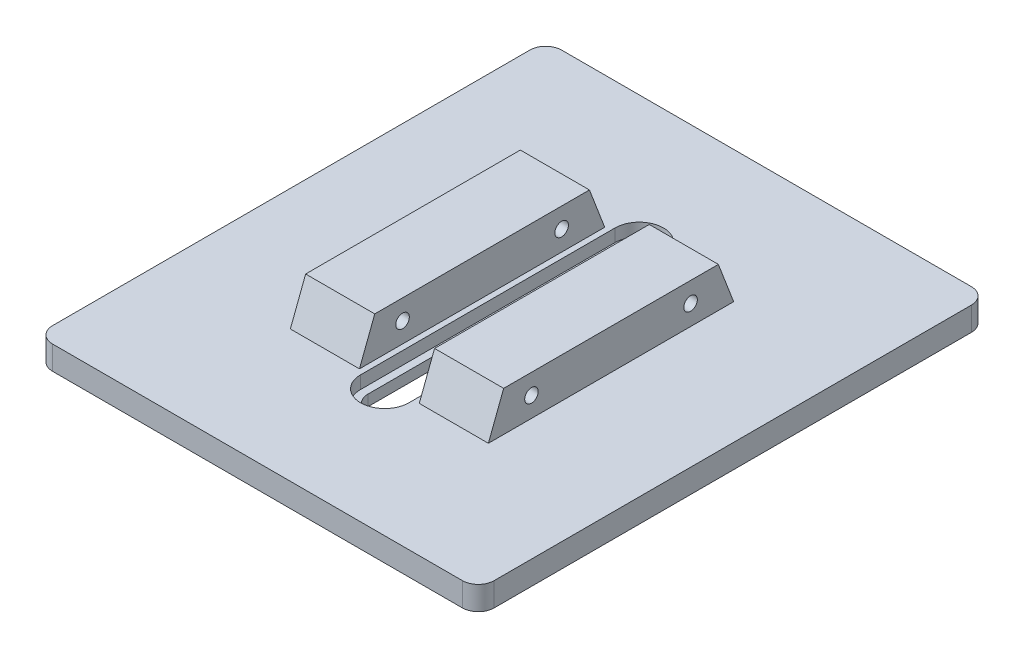
ISO-10303-21;
HEADER;
FILE_DESCRIPTION(('STEP AP214'),'2;1');
FILE_NAME('part.step','',(''),(''),'','','');
FILE_SCHEMA(('AUTOMOTIVE_DESIGN { 1 0 10303 214 1 1 1 1 }'));
ENDSEC;
DATA;
#1=APPLICATION_CONTEXT('core data for automotive mechanical design processes');
#2=APPLICATION_PROTOCOL_DEFINITION('international standard','automotive_design',2000,#1);
#3=PRODUCT_CONTEXT('',#1,'mechanical');
#4=PRODUCT('Part','Part','',(#3));
#5=PRODUCT_RELATED_PRODUCT_CATEGORY('part','',(#4));
#6=PRODUCT_DEFINITION_FORMATION('','',#4);
#7=PRODUCT_DEFINITION_CONTEXT('part definition',#1,'design');
#8=PRODUCT_DEFINITION('design','',#6,#7);
#9=PRODUCT_DEFINITION_SHAPE('','',#8);
#10=(LENGTH_UNIT() NAMED_UNIT(*) SI_UNIT(.MILLI.,.METRE.));
#11=(NAMED_UNIT(*) PLANE_ANGLE_UNIT() SI_UNIT($,.RADIAN.));
#12=(NAMED_UNIT(*) SI_UNIT($,.STERADIAN.) SOLID_ANGLE_UNIT());
#13=UNCERTAINTY_MEASURE_WITH_UNIT(LENGTH_MEASURE(1.E-05),#10,'distance_accuracy_value','');
#14=(GEOMETRIC_REPRESENTATION_CONTEXT(3) GLOBAL_UNCERTAINTY_ASSIGNED_CONTEXT((#13)) GLOBAL_UNIT_ASSIGNED_CONTEXT((#10,
#11,#12)) REPRESENTATION_CONTEXT('',''));
#15=CARTESIAN_POINT('',(0.,0.,0.));
#16=DIRECTION('',(0.,0.,1.));
#17=DIRECTION('',(1.,0.,0.));
#18=AXIS2_PLACEMENT_3D('',#15,#16,#17);
#19=CARTESIAN_POINT('',(-15.42415,0.,-5.20170833333334));
#20=DIRECTION('',(0.,1.,0.));
#21=DIRECTION('',(0.,0.,1.));
#22=AXIS2_PLACEMENT_3D('',#19,#20,#21);
#23=CYLINDRICAL_SURFACE('',#22,3.302);
#24=CARTESIAN_POINT('',(-15.42415,2.1844,-5.20170833333334));
#25=DIRECTION('',(0.,1.,0.));
#26=DIRECTION('',(0.,0.,1.));
#27=AXIS2_PLACEMENT_3D('',#24,#25,#26);
#28=CIRCLE('',#27,3.302);
#29=CARTESIAN_POINT('',(-12.12215,2.1844,-5.20170833333334));
#30=VERTEX_POINT('',#29);
#31=CARTESIAN_POINT('',(-18.72615,2.1844,-5.20170833333334));
#32=VERTEX_POINT('',#31);
#33=EDGE_CURVE('E410',#30,#32,#28,.F.);
#34=ORIENTED_EDGE('',*,*,#33,.F.);
#35=DIRECTION('',(0.,1.,0.));
#36=VECTOR('',#35,1.);
#37=CARTESIAN_POINT('',(-12.12215,0.,-5.20170833333334));
#38=LINE('',#37,#36);
#39=CARTESIAN_POINT('',(-12.12215,0.,-5.20170833333334));
#40=VERTEX_POINT('',#39);
#41=EDGE_CURVE('E321',#40,#30,#38,.T.);
#42=ORIENTED_EDGE('',*,*,#41,.F.);
#43=CARTESIAN_POINT('',(-15.42415,0.,-5.20170833333334));
#44=DIRECTION('',(0.,1.,0.));
#45=DIRECTION('',(0.,0.,1.));
#46=AXIS2_PLACEMENT_3D('',#43,#44,#45);
#47=CIRCLE('',#46,3.302);
#48=CARTESIAN_POINT('',(-18.72615,0.,-5.20170833333334));
#49=VERTEX_POINT('',#48);
#50=EDGE_CURVE('E412',#49,#40,#47,.T.);
#51=ORIENTED_EDGE('',*,*,#50,.F.);
#52=DIRECTION('',(0.,1.,0.));
#53=VECTOR('',#52,1.);
#54=CARTESIAN_POINT('',(-18.72615,0.,-5.20170833333334));
#55=LINE('',#54,#53);
#56=EDGE_CURVE('E332',#49,#32,#55,.T.);
#57=ORIENTED_EDGE('',*,*,#56,.T.);
#58=EDGE_LOOP('',(#34,#42,#51,#57));
#59=FACE_BOUND('',#58,.T.);
#60=ADVANCED_FACE('F35',(#59),#23,.F.);
#61=CARTESIAN_POINT('',(-18.72615,0.,-5.20170833333334));
#62=DIRECTION('',(-1.,0.,0.));
#63=DIRECTION('',(0.,0.,1.));
#64=AXIS2_PLACEMENT_3D('',#61,#62,#63);
#65=PLANE('',#64);
#66=DIRECTION('',(0.,0.,-1.));
#67=VECTOR('',#66,1.);
#68=CARTESIAN_POINT('',(-18.72615,2.1844,-5.20170833333334));
#69=LINE('',#68,#67);
#70=CARTESIAN_POINT('',(-18.72615,2.1844,-56.0017083333333));
#71=VERTEX_POINT('',#70);
#72=EDGE_CURVE('E408',#32,#71,#69,.T.);
#73=ORIENTED_EDGE('',*,*,#72,.F.);
#74=ORIENTED_EDGE('',*,*,#56,.F.);
#75=DIRECTION('',(0.,0.,1.));
#76=VECTOR('',#75,1.);
#77=CARTESIAN_POINT('',(-18.72615,0.,-5.20170833333334));
#78=LINE('',#77,#76);
#79=CARTESIAN_POINT('',(-18.72615,0.,-56.0017083333333));
#80=VERTEX_POINT('',#79);
#81=EDGE_CURVE('E421',#80,#49,#78,.T.);
#82=ORIENTED_EDGE('',*,*,#81,.F.);
#83=DIRECTION('',(0.,1.,0.));
#84=VECTOR('',#83,1.);
#85=CARTESIAN_POINT('',(-18.72615,0.,-56.0017083333333));
#86=LINE('',#85,#84);
#87=EDGE_CURVE('E426',#80,#71,#86,.T.);
#88=ORIENTED_EDGE('',*,*,#87,.T.);
#89=EDGE_LOOP('',(#73,#74,#82,#88));
#90=FACE_BOUND('',#89,.T.);
#91=ADVANCED_FACE('F445',(#90),#65,.F.);
#92=CARTESIAN_POINT('',(-15.42415,0.,-56.0017083333333));
#93=DIRECTION('',(0.,1.,0.));
#94=DIRECTION('',(0.,0.,1.));
#95=AXIS2_PLACEMENT_3D('',#92,#93,#94);
#96=CYLINDRICAL_SURFACE('',#95,3.302);
#97=CARTESIAN_POINT('',(-15.42415,2.1844,-56.0017083333333));
#98=DIRECTION('',(0.,1.,0.));
#99=DIRECTION('',(0.,0.,1.));
#100=AXIS2_PLACEMENT_3D('',#97,#98,#99);
#101=CIRCLE('',#100,3.302);
#102=CARTESIAN_POINT('',(-12.12215,2.1844,-56.0017083333333));
#103=VERTEX_POINT('',#102);
#104=EDGE_CURVE('E399',#71,#103,#101,.F.);
#105=ORIENTED_EDGE('',*,*,#104,.F.);
#106=ORIENTED_EDGE('',*,*,#87,.F.);
#107=CARTESIAN_POINT('',(-15.42415,0.,-56.0017083333333));
#108=DIRECTION('',(0.,1.,0.));
#109=DIRECTION('',(0.,0.,1.));
#110=AXIS2_PLACEMENT_3D('',#107,#108,#109);
#111=CIRCLE('',#110,3.302);
#112=CARTESIAN_POINT('',(-12.12215,0.,-56.0017083333333));
#113=VERTEX_POINT('',#112);
#114=EDGE_CURVE('E418',#113,#80,#111,.T.);
#115=ORIENTED_EDGE('',*,*,#114,.F.);
#116=DIRECTION('',(0.,1.,0.));
#117=VECTOR('',#116,1.);
#118=CARTESIAN_POINT('',(-12.12215,0.,-56.0017083333333));
#119=LINE('',#118,#117);
#120=EDGE_CURVE('E428',#113,#103,#119,.T.);
#121=ORIENTED_EDGE('',*,*,#120,.T.);
#122=EDGE_LOOP('',(#105,#106,#115,#121));
#123=FACE_BOUND('',#122,.T.);
#124=ADVANCED_FACE('F447',(#123),#96,.F.);
#125=CARTESIAN_POINT('',(-12.12215,0.,-5.20170833333334));
#126=DIRECTION('',(1.,0.,0.));
#127=DIRECTION('',(0.,0.,-1.));
#128=AXIS2_PLACEMENT_3D('',#125,#126,#127);
#129=PLANE('',#128);
#130=DIRECTION('',(0.,0.,1.));
#131=VECTOR('',#130,1.);
#132=CARTESIAN_POINT('',(-12.12215,2.1844,-5.20170833333334));
#133=LINE('',#132,#131);
#134=EDGE_CURVE('E239',#103,#30,#133,.T.);
#135=ORIENTED_EDGE('',*,*,#134,.F.);
#136=ORIENTED_EDGE('',*,*,#120,.F.);
#137=DIRECTION('',(0.,0.,-1.));
#138=VECTOR('',#137,1.);
#139=CARTESIAN_POINT('',(-12.12215,0.,-5.20170833333334));
#140=LINE('',#139,#138);
#141=EDGE_CURVE('E415',#40,#113,#140,.T.);
#142=ORIENTED_EDGE('',*,*,#141,.F.);
#143=ORIENTED_EDGE('',*,*,#41,.T.);
#144=EDGE_LOOP('',(#135,#136,#142,#143));
#145=FACE_BOUND('',#144,.T.);
#146=ADVANCED_FACE('F437',(#145),#129,.F.);
#147=CARTESIAN_POINT('',(0.,12.7,0.));
#148=DIRECTION('',(0.,1.,0.));
#149=DIRECTION('',(0.,0.,1.));
#150=AXIS2_PLACEMENT_3D('',#147,#148,#149);
#151=PLANE('',#150);
#152=DIRECTION('',(1.,0.,0.));
#153=VECTOR('',#152,1.);
#154=CARTESIAN_POINT('',(0.,12.7,-52.0257445406089));
#155=LINE('',#154,#153);
#156=CARTESIAN_POINT('',(-9.45514999999998,12.7,-52.0257445406089));
#157=VERTEX_POINT('',#156);
#158=CARTESIAN_POINT('',(4.33705000000002,12.7,-52.0257445406089));
#159=VERTEX_POINT('',#158);
#160=EDGE_CURVE('E58',#157,#159,#155,.T.);
#161=ORIENTED_EDGE('',*,*,#160,.F.);
#162=DIRECTION('',(0.,0.,-1.));
#163=VECTOR('',#162,1.);
#164=CARTESIAN_POINT('',(-9.45514999999998,12.7,20.1982916666667));
#165=LINE('',#164,#163);
#166=CARTESIAN_POINT('',(-9.45514999999998,12.7,-9.17767212605782));
#167=VERTEX_POINT('',#166);
#168=EDGE_CURVE('E330',#167,#157,#165,.T.);
#169=ORIENTED_EDGE('',*,*,#168,.F.);
#170=DIRECTION('',(-1.,0.,0.));
#171=VECTOR('',#170,1.);
#172=CARTESIAN_POINT('',(0.,12.7,-9.17767212605782));
#173=LINE('',#172,#171);
#174=CARTESIAN_POINT('',(4.33705000000003,12.7,-9.17767212605783));
#175=VERTEX_POINT('',#174);
#176=EDGE_CURVE('E514',#175,#167,#173,.T.);
#177=ORIENTED_EDGE('',*,*,#176,.F.);
#178=DIRECTION('',(0.,0.,1.));
#179=VECTOR('',#178,1.);
#180=CARTESIAN_POINT('',(4.33705000000002,12.7,-81.4017083333333));
#181=LINE('',#180,#179);
#182=EDGE_CURVE('E315',#159,#175,#181,.T.);
#183=ORIENTED_EDGE('',*,*,#182,.F.);
#184=EDGE_LOOP('',(#161,#169,#177,#183));
#185=FACE_BOUND('',#184,.T.);
#186=ADVANCED_FACE('F460',(#185),#151,.T.);
#187=CARTESIAN_POINT('',(-59.49315,12.7,-81.4017083333333));
#188=DIRECTION('',(1.,0.,0.));
#189=DIRECTION('',(0.,0.,-1.));
#190=AXIS2_PLACEMENT_3D('',#187,#188,#189);
#191=PLANE('',#190);
#192=DIRECTION('',(0.,0.,1.));
#193=VECTOR('',#192,1.);
#194=CARTESIAN_POINT('',(-59.49315,0.,-81.4017083333333));
#195=LINE('',#194,#193);
#196=CARTESIAN_POINT('',(-59.49315,0.,-78.2267083333333));
#197=VERTEX_POINT('',#196);
#198=CARTESIAN_POINT('',(-59.49315,0.,17.0232916666667));
#199=VERTEX_POINT('',#198);
#200=EDGE_CURVE('E220',#197,#199,#195,.T.);
#201=ORIENTED_EDGE('',*,*,#200,.T.);
#202=DIRECTION('',(0.,-1.,0.));
#203=VECTOR('',#202,1.);
#204=CARTESIAN_POINT('',(-59.49315,12.7,17.0232916666667));
#205=LINE('',#204,#203);
#206=CARTESIAN_POINT('',(-59.49315,4.7244,17.0232916666667));
#207=VERTEX_POINT('',#206);
#208=EDGE_CURVE('E257',#199,#207,#205,.F.);
#209=ORIENTED_EDGE('',*,*,#208,.T.);
#210=DIRECTION('',(0.,0.,1.));
#211=VECTOR('',#210,1.);
#212=CARTESIAN_POINT('',(-59.49315,4.7244,-81.4017083333333));
#213=LINE('',#212,#211);
#214=CARTESIAN_POINT('',(-59.49315,4.7244,-78.2267083333333));
#215=VERTEX_POINT('',#214);
#216=EDGE_CURVE('E217',#215,#207,#213,.T.);
#217=ORIENTED_EDGE('',*,*,#216,.F.);
#218=DIRECTION('',(0.,-1.,0.));
#219=VECTOR('',#218,1.);
#220=CARTESIAN_POINT('',(-59.49315,12.7,-78.2267083333333));
#221=LINE('',#220,#219);
#222=EDGE_CURVE('E254',#215,#197,#221,.T.);
#223=ORIENTED_EDGE('',*,*,#222,.T.);
#224=EDGE_LOOP('',(#201,#209,#217,#223));
#225=FACE_BOUND('',#224,.T.);
#226=ADVANCED_FACE('F294',(#225),#191,.F.);
#227=CARTESIAN_POINT('',(-59.49315,12.7,20.1982916666667));
#228=DIRECTION('',(0.,0.,-1.));
#229=DIRECTION('',(-1.,0.,0.));
#230=AXIS2_PLACEMENT_3D('',#227,#228,#229);
#231=PLANE('',#230);
#232=DIRECTION('',(1.,0.,0.));
#233=VECTOR('',#232,1.);
#234=CARTESIAN_POINT('',(28.64485,4.7244,20.1982916666667));
#235=LINE('',#234,#233);
#236=CARTESIAN_POINT('',(-56.31815,4.7244,20.1982916666667));
#237=VERTEX_POINT('',#236);
#238=CARTESIAN_POINT('',(25.46985,4.7244,20.1982916666667));
#239=VERTEX_POINT('',#238);
#240=EDGE_CURVE('E227',#237,#239,#235,.T.);
#241=ORIENTED_EDGE('',*,*,#240,.F.);
#242=DIRECTION('',(0.,-1.,0.));
#243=VECTOR('',#242,1.);
#244=CARTESIAN_POINT('',(-56.31815,12.7,20.1982916666667));
#245=LINE('',#244,#243);
#246=CARTESIAN_POINT('',(-56.31815,0.,20.1982916666667));
#247=VERTEX_POINT('',#246);
#248=EDGE_CURVE('E243',#237,#247,#245,.T.);
#249=ORIENTED_EDGE('',*,*,#248,.T.);
#250=DIRECTION('',(1.,0.,0.));
#251=VECTOR('',#250,1.);
#252=CARTESIAN_POINT('',(-59.49315,0.,20.1982916666667));
#253=LINE('',#252,#251);
#254=CARTESIAN_POINT('',(25.46985,0.,20.1982916666667));
#255=VERTEX_POINT('',#254);
#256=EDGE_CURVE('E230',#247,#255,#253,.T.);
#257=ORIENTED_EDGE('',*,*,#256,.T.);
#258=DIRECTION('',(0.,-1.,0.));
#259=VECTOR('',#258,1.);
#260=CARTESIAN_POINT('',(25.46985,12.7,20.1982916666667));
#261=LINE('',#260,#259);
#262=EDGE_CURVE('E241',#255,#239,#261,.F.);
#263=ORIENTED_EDGE('',*,*,#262,.T.);
#264=EDGE_LOOP('',(#241,#249,#257,#263));
#265=FACE_BOUND('',#264,.T.);
#266=ADVANCED_FACE('F303',(#265),#231,.F.);
#267=CARTESIAN_POINT('',(28.64485,12.7,-81.4017083333333));
#268=DIRECTION('',(-1.,0.,0.));
#269=DIRECTION('',(0.,0.,1.));
#270=AXIS2_PLACEMENT_3D('',#267,#268,#269);
#271=PLANE('',#270);
#272=DIRECTION('',(0.,0.,-1.));
#273=VECTOR('',#272,1.);
#274=CARTESIAN_POINT('',(28.64485,4.7244,-81.4017083333333));
#275=LINE('',#274,#273);
#276=CARTESIAN_POINT('',(28.64485,4.7244,17.0232916666667));
#277=VERTEX_POINT('',#276);
#278=CARTESIAN_POINT('',(28.64485,4.7244,-78.2267083333333));
#279=VERTEX_POINT('',#278);
#280=EDGE_CURVE('E313',#277,#279,#275,.T.);
#281=ORIENTED_EDGE('',*,*,#280,.F.);
#282=DIRECTION('',(0.,-1.,0.));
#283=VECTOR('',#282,1.);
#284=CARTESIAN_POINT('',(28.64485,12.7,17.0232916666667));
#285=LINE('',#284,#283);
#286=CARTESIAN_POINT('',(28.64485,0.,17.0232916666667));
#287=VERTEX_POINT('',#286);
#288=EDGE_CURVE('E267',#277,#287,#285,.T.);
#289=ORIENTED_EDGE('',*,*,#288,.T.);
#290=DIRECTION('',(0.,0.,-1.));
#291=VECTOR('',#290,1.);
#292=CARTESIAN_POINT('',(28.64485,0.,-81.4017083333333));
#293=LINE('',#292,#291);
#294=CARTESIAN_POINT('',(28.64485,0.,-78.2267083333333));
#295=VERTEX_POINT('',#294);
#296=EDGE_CURVE('E233',#287,#295,#293,.T.);
#297=ORIENTED_EDGE('',*,*,#296,.T.);
#298=DIRECTION('',(0.,-1.,0.));
#299=VECTOR('',#298,1.);
#300=CARTESIAN_POINT('',(28.64485,12.7,-78.2267083333333));
#301=LINE('',#300,#299);
#302=EDGE_CURVE('E264',#295,#279,#301,.F.);
#303=ORIENTED_EDGE('',*,*,#302,.T.);
#304=EDGE_LOOP('',(#281,#289,#297,#303));
#305=FACE_BOUND('',#304,.T.);
#306=ADVANCED_FACE('F311',(#305),#271,.F.);
#307=CARTESIAN_POINT('',(-59.49315,12.7,-81.4017083333333));
#308=DIRECTION('',(0.,0.,1.));
#309=DIRECTION('',(1.,0.,0.));
#310=AXIS2_PLACEMENT_3D('',#307,#308,#309);
#311=PLANE('',#310);
#312=DIRECTION('',(-1.,0.,0.));
#313=VECTOR('',#312,1.);
#314=CARTESIAN_POINT('',(-59.49315,4.7244,-81.4017083333333));
#315=LINE('',#314,#313);
#316=CARTESIAN_POINT('',(25.46985,4.7244,-81.4017083333333));
#317=VERTEX_POINT('',#316);
#318=CARTESIAN_POINT('',(-56.31815,4.7244,-81.4017083333333));
#319=VERTEX_POINT('',#318);
#320=EDGE_CURVE('E216',#317,#319,#315,.T.);
#321=ORIENTED_EDGE('',*,*,#320,.F.);
#322=DIRECTION('',(0.,-1.,0.));
#323=VECTOR('',#322,1.);
#324=CARTESIAN_POINT('',(25.46985,12.7,-81.4017083333333));
#325=LINE('',#324,#323);
#326=CARTESIAN_POINT('',(25.46985,0.,-81.4017083333333));
#327=VERTEX_POINT('',#326);
#328=EDGE_CURVE('E43',#317,#327,#325,.T.);
#329=ORIENTED_EDGE('',*,*,#328,.T.);
#330=DIRECTION('',(-1.,0.,0.));
#331=VECTOR('',#330,1.);
#332=CARTESIAN_POINT('',(-59.49315,0.,-81.4017083333333));
#333=LINE('',#332,#331);
#334=CARTESIAN_POINT('',(-56.31815,0.,-81.4017083333333));
#335=VERTEX_POINT('',#334);
#336=EDGE_CURVE('E236',#327,#335,#333,.T.);
#337=ORIENTED_EDGE('',*,*,#336,.T.);
#338=DIRECTION('',(0.,-1.,0.));
#339=VECTOR('',#338,1.);
#340=CARTESIAN_POINT('',(-56.31815,12.7,-81.4017083333333));
#341=LINE('',#340,#339);
#342=EDGE_CURVE('E275',#335,#319,#341,.F.);
#343=ORIENTED_EDGE('',*,*,#342,.T.);
#344=EDGE_LOOP('',(#321,#329,#337,#343));
#345=FACE_BOUND('',#344,.T.);
#346=ADVANCED_FACE('F280',(#345),#311,.F.);
#347=DIRECTION('',(1.,0.,0.));
#348=VECTOR('',#347,1.);
#349=CARTESIAN_POINT('',(0.,12.7,-52.0257445406089));
#350=LINE('',#349,#348);
#351=CARTESIAN_POINT('',(-35.18535,12.7,-52.0257445406089));
#352=VERTEX_POINT('',#351);
#353=CARTESIAN_POINT('',(-21.39315,12.7,-52.0257445406089));
#354=VERTEX_POINT('',#353);
#355=EDGE_CURVE('E50',#352,#354,#350,.T.);
#356=ORIENTED_EDGE('',*,*,#355,.F.);
#357=DIRECTION('',(0.,0.,-1.));
#358=VECTOR('',#357,1.);
#359=CARTESIAN_POINT('',(-35.18535,12.7,-81.4017083333333));
#360=LINE('',#359,#358);
#361=CARTESIAN_POINT('',(-35.18535,12.7,-9.17767212605781));
#362=VERTEX_POINT('',#361);
#363=EDGE_CURVE('E210',#362,#352,#360,.T.);
#364=ORIENTED_EDGE('',*,*,#363,.F.);
#365=DIRECTION('',(-1.,0.,0.));
#366=VECTOR('',#365,1.);
#367=CARTESIAN_POINT('',(0.,12.7,-9.17767212605782));
#368=LINE('',#367,#366);
#369=CARTESIAN_POINT('',(-21.39315,12.7,-9.17767212605781));
#370=VERTEX_POINT('',#369);
#371=EDGE_CURVE('E343',#370,#362,#368,.T.);
#372=ORIENTED_EDGE('',*,*,#371,.F.);
#373=DIRECTION('',(0.,0.,1.));
#374=VECTOR('',#373,1.);
#375=CARTESIAN_POINT('',(-21.39315,12.7,20.1982916666667));
#376=LINE('',#375,#374);
#377=EDGE_CURVE('E328',#354,#370,#376,.T.);
#378=ORIENTED_EDGE('',*,*,#377,.F.);
#379=EDGE_LOOP('',(#356,#364,#372,#378));
#380=FACE_BOUND('',#379,.T.);
#381=ADVANCED_FACE('F346',(#380),#151,.T.);
#382=CARTESIAN_POINT('',(0.,0.,0.));
#383=DIRECTION('',(0.,1.,0.));
#384=DIRECTION('',(0.,0.,1.));
#385=AXIS2_PLACEMENT_3D('',#382,#383,#384);
#386=PLANE('',#385);
#387=ORIENTED_EDGE('',*,*,#81,.T.);
#388=ORIENTED_EDGE('',*,*,#50,.T.);
#389=ORIENTED_EDGE('',*,*,#141,.T.);
#390=ORIENTED_EDGE('',*,*,#114,.T.);
#391=EDGE_LOOP('',(#387,#388,#389,#390));
#392=FACE_BOUND('',#391,.T.);
#393=ORIENTED_EDGE('',*,*,#256,.F.);
#394=CARTESIAN_POINT('',(-56.31815,0.,17.0232916666667));
#395=DIRECTION('',(0.,1.,0.));
#396=DIRECTION('',(0.,0.,1.));
#397=AXIS2_PLACEMENT_3D('',#394,#395,#396);
#398=CIRCLE('',#397,3.175);
#399=EDGE_CURVE('E252',#247,#199,#398,.F.);
#400=ORIENTED_EDGE('',*,*,#399,.T.);
#401=ORIENTED_EDGE('',*,*,#200,.F.);
#402=CARTESIAN_POINT('',(-56.31815,0.,-78.2267083333333));
#403=DIRECTION('',(0.,1.,0.));
#404=DIRECTION('',(0.,0.,1.));
#405=AXIS2_PLACEMENT_3D('',#402,#403,#404);
#406=CIRCLE('',#405,3.175);
#407=EDGE_CURVE('E246',#197,#335,#406,.F.);
#408=ORIENTED_EDGE('',*,*,#407,.T.);
#409=ORIENTED_EDGE('',*,*,#336,.F.);
#410=CARTESIAN_POINT('',(25.46985,0.,-78.2267083333333));
#411=DIRECTION('',(0.,1.,0.));
#412=DIRECTION('',(0.,0.,1.));
#413=AXIS2_PLACEMENT_3D('',#410,#411,#412);
#414=CIRCLE('',#413,3.175);
#415=EDGE_CURVE('E248',#327,#295,#414,.F.);
#416=ORIENTED_EDGE('',*,*,#415,.T.);
#417=ORIENTED_EDGE('',*,*,#296,.F.);
#418=CARTESIAN_POINT('',(25.46985,0.,17.0232916666667));
#419=DIRECTION('',(0.,1.,0.));
#420=DIRECTION('',(0.,0.,1.));
#421=AXIS2_PLACEMENT_3D('',#418,#419,#420);
#422=CIRCLE('',#421,3.175);
#423=EDGE_CURVE('E250',#287,#255,#422,.F.);
#424=ORIENTED_EDGE('',*,*,#423,.T.);
#425=EDGE_LOOP('',(#393,#400,#401,#408,#409,#416,#417,#424));
#426=FACE_BOUND('',#425,.T.);
#427=ADVANCED_FACE('F286',(#392,#426),#386,.F.);
#428=CARTESIAN_POINT('',(-35.18535,4.7244,-81.4017083333333));
#429=DIRECTION('',(1.,0.,0.));
#430=DIRECTION('',(0.,0.,-1.));
#431=AXIS2_PLACEMENT_3D('',#428,#429,#430);
#432=PLANE('',#431);
#433=CARTESIAN_POINT('',(-35.18535,8.71219999999999,-46.4767083333333));
#434=DIRECTION('',(1.,0.,0.));
#435=DIRECTION('',(0.,0.,-1.));
#436=AXIS2_PLACEMENT_3D('',#433,#434,#435);
#437=CIRCLE('',#436,1.35254999999999);
#438=CARTESIAN_POINT('',(-35.18535,8.71219999999999,-47.8292583333333));
#439=VERTEX_POINT('',#438);
#440=EDGE_CURVE('E359',#439,#439,#437,.T.);
#441=ORIENTED_EDGE('',*,*,#440,.T.);
#442=EDGE_LOOP('',(#441));
#443=FACE_BOUND('',#442,.T.);
#444=CARTESIAN_POINT('',(-35.18535,8.7122,-14.7267083333333));
#445=DIRECTION('',(1.,0.,0.));
#446=DIRECTION('',(0.,0.,-1.));
#447=AXIS2_PLACEMENT_3D('',#444,#445,#446);
#448=CIRCLE('',#447,1.35254999999999);
#449=CARTESIAN_POINT('',(-35.18535,8.7122,-16.0792583333333));
#450=VERTEX_POINT('',#449);
#451=EDGE_CURVE('E371',#450,#450,#448,.T.);
#452=ORIENTED_EDGE('',*,*,#451,.T.);
#453=EDGE_LOOP('',(#452));
#454=FACE_BOUND('',#453,.T.);
#455=ORIENTED_EDGE('',*,*,#363,.T.);
#456=DIRECTION('',(0.,0.934076458407012,0.357073059540781));
#457=VECTOR('',#456,1.);
#458=CARTESIAN_POINT('',(-35.18535,4.7244,-55.0746083333333));
#459=LINE('',#458,#457);
#460=CARTESIAN_POINT('',(-35.18535,4.7244,-55.0746083333333));
#461=VERTEX_POINT('',#460);
#462=EDGE_CURVE('E196',#461,#352,#459,.T.);
#463=ORIENTED_EDGE('',*,*,#462,.F.);
#464=DIRECTION('',(0.,0.,-1.));
#465=VECTOR('',#464,1.);
#466=CARTESIAN_POINT('',(-35.18535,4.7244,-81.4017083333333));
#467=LINE('',#466,#465);
#468=CARTESIAN_POINT('',(-35.18535,4.7244,-6.12880833333335));
#469=VERTEX_POINT('',#468);
#470=EDGE_CURVE('E208',#469,#461,#467,.T.);
#471=ORIENTED_EDGE('',*,*,#470,.F.);
#472=DIRECTION('',(0.,-0.934076458407012,0.357073059540779));
#473=VECTOR('',#472,1.);
#474=CARTESIAN_POINT('',(-35.18535,4.7244,-6.12880833333335));
#475=LINE('',#474,#473);
#476=EDGE_CURVE('E508',#362,#469,#475,.T.);
#477=ORIENTED_EDGE('',*,*,#476,.F.);
#478=EDGE_LOOP('',(#455,#463,#471,#477));
#479=FACE_BOUND('',#478,.T.);
#480=ADVANCED_FACE('F206',(#443,#454,#479),#432,.F.);
#481=CARTESIAN_POINT('',(0.,4.7244,0.));
#482=DIRECTION('',(0.,1.,0.));
#483=DIRECTION('',(0.,0.,1.));
#484=AXIS2_PLACEMENT_3D('',#481,#482,#483);
#485=PLANE('',#484);
#486=CARTESIAN_POINT('',(-15.42415,4.7244,-5.20170833333334));
#487=DIRECTION('',(0.,1.,0.));
#488=DIRECTION('',(0.,0.,1.));
#489=AXIS2_PLACEMENT_3D('',#486,#487,#488);
#490=CIRCLE('',#489,4.826);
#491=CARTESIAN_POINT('',(-20.25015,4.7244,-5.20170833333334));
#492=VERTEX_POINT('',#491);
#493=CARTESIAN_POINT('',(-10.59815,4.7244,-5.20170833333334));
#494=VERTEX_POINT('',#493);
#495=EDGE_CURVE('E374',#492,#494,#490,.T.);
#496=ORIENTED_EDGE('',*,*,#495,.F.);
#497=DIRECTION('',(0.,0.,1.));
#498=VECTOR('',#497,1.);
#499=CARTESIAN_POINT('',(-20.25015,4.7244,-5.20170833333334));
#500=LINE('',#499,#498);
#501=CARTESIAN_POINT('',(-20.25015,4.7244,-56.0017083333333));
#502=VERTEX_POINT('',#501);
#503=EDGE_CURVE('E379',#502,#492,#500,.T.);
#504=ORIENTED_EDGE('',*,*,#503,.F.);
#505=CARTESIAN_POINT('',(-15.42415,4.7244,-56.0017083333333));
#506=DIRECTION('',(0.,1.,0.));
#507=DIRECTION('',(0.,0.,1.));
#508=AXIS2_PLACEMENT_3D('',#505,#506,#507);
#509=CIRCLE('',#508,4.826);
#510=CARTESIAN_POINT('',(-10.59815,4.7244,-56.0017083333333));
#511=VERTEX_POINT('',#510);
#512=EDGE_CURVE('E392',#511,#502,#509,.T.);
#513=ORIENTED_EDGE('',*,*,#512,.F.);
#514=DIRECTION('',(0.,0.,-1.));
#515=VECTOR('',#514,1.);
#516=CARTESIAN_POINT('',(-10.59815,4.7244,-5.20170833333334));
#517=LINE('',#516,#515);
#518=EDGE_CURVE('E390',#494,#511,#517,.T.);
#519=ORIENTED_EDGE('',*,*,#518,.F.);
#520=EDGE_LOOP('',(#496,#504,#513,#519));
#521=FACE_BOUND('',#520,.T.);
#522=DIRECTION('',(0.,0.,-1.));
#523=VECTOR('',#522,1.);
#524=CARTESIAN_POINT('',(-9.45514999999998,4.7244,20.1982916666667));
#525=LINE('',#524,#523);
#526=CARTESIAN_POINT('',(-9.45514999999998,4.7244,-6.12880833333335));
#527=VERTEX_POINT('',#526);
#528=CARTESIAN_POINT('',(-9.45514999999998,4.7244,-55.0746083333333));
#529=VERTEX_POINT('',#528);
#530=EDGE_CURVE('E325',#527,#529,#525,.T.);
#531=ORIENTED_EDGE('',*,*,#530,.T.);
#532=DIRECTION('',(-1.,0.,0.));
#533=VECTOR('',#532,1.);
#534=CARTESIAN_POINT('',(28.64485,4.7244,-55.0746083333334));
#535=LINE('',#534,#533);
#536=CARTESIAN_POINT('',(4.33705000000002,4.7244,-55.0746083333334));
#537=VERTEX_POINT('',#536);
#538=EDGE_CURVE('E201',#537,#529,#535,.T.);
#539=ORIENTED_EDGE('',*,*,#538,.F.);
#540=DIRECTION('',(0.,0.,1.));
#541=VECTOR('',#540,1.);
#542=CARTESIAN_POINT('',(4.33705000000002,4.7244,-81.4017083333333));
#543=LINE('',#542,#541);
#544=CARTESIAN_POINT('',(4.33705000000003,4.7244,-6.12880833333336));
#545=VERTEX_POINT('',#544);
#546=EDGE_CURVE('E314',#537,#545,#543,.T.);
#547=ORIENTED_EDGE('',*,*,#546,.T.);
#548=DIRECTION('',(-1.,0.,0.));
#549=VECTOR('',#548,1.);
#550=CARTESIAN_POINT('',(28.64485,4.7244,-6.12880833333336));
#551=LINE('',#550,#549);
#552=EDGE_CURVE('E497',#545,#527,#551,.T.);
#553=ORIENTED_EDGE('',*,*,#552,.T.);
#554=EDGE_LOOP('',(#531,#539,#547,#553));
#555=FACE_BOUND('',#554,.T.);
#556=ORIENTED_EDGE('',*,*,#280,.T.);
#557=CARTESIAN_POINT('',(25.46985,4.7244,-78.2267083333333));
#558=DIRECTION('',(0.,-1.,0.));
#559=DIRECTION('',(0.,0.,-1.));
#560=AXIS2_PLACEMENT_3D('',#557,#558,#559);
#561=CIRCLE('',#560,3.175);
#562=EDGE_CURVE('E270',#279,#317,#561,.F.);
#563=ORIENTED_EDGE('',*,*,#562,.T.);
#564=ORIENTED_EDGE('',*,*,#320,.T.);
#565=CARTESIAN_POINT('',(-56.31815,4.7244,-78.2267083333333));
#566=DIRECTION('',(0.,1.,0.));
#567=DIRECTION('',(0.,0.,1.));
#568=AXIS2_PLACEMENT_3D('',#565,#566,#567);
#569=CIRCLE('',#568,3.175);
#570=EDGE_CURVE('E259',#319,#215,#569,.T.);
#571=ORIENTED_EDGE('',*,*,#570,.T.);
#572=ORIENTED_EDGE('',*,*,#216,.T.);
#573=CARTESIAN_POINT('',(-56.31815,4.7244,17.0232916666667));
#574=DIRECTION('',(0.,1.,0.));
#575=DIRECTION('',(0.,0.,1.));
#576=AXIS2_PLACEMENT_3D('',#573,#574,#575);
#577=CIRCLE('',#576,3.175);
#578=EDGE_CURVE('E261',#207,#237,#577,.T.);
#579=ORIENTED_EDGE('',*,*,#578,.T.);
#580=ORIENTED_EDGE('',*,*,#240,.T.);
#581=CARTESIAN_POINT('',(25.46985,4.7244,17.0232916666667));
#582=DIRECTION('',(0.,-1.,0.));
#583=DIRECTION('',(0.,0.,-1.));
#584=AXIS2_PLACEMENT_3D('',#581,#582,#583);
#585=CIRCLE('',#584,3.175);
#586=EDGE_CURVE('E273',#239,#277,#585,.F.);
#587=ORIENTED_EDGE('',*,*,#586,.T.);
#588=EDGE_LOOP('',(#556,#563,#564,#571,#572,#579,#580,#587));
#589=FACE_BOUND('',#588,.T.);
#590=CARTESIAN_POINT('',(-21.39315,4.7244,-55.0746083333333));
#591=VERTEX_POINT('',#590);
#592=EDGE_CURVE('E193',#591,#461,#535,.T.);
#593=ORIENTED_EDGE('',*,*,#592,.F.);
#594=DIRECTION('',(0.,0.,1.));
#595=VECTOR('',#594,1.);
#596=CARTESIAN_POINT('',(-21.39315,4.7244,20.1982916666667));
#597=LINE('',#596,#595);
#598=CARTESIAN_POINT('',(-21.39315,4.7244,-6.12880833333335));
#599=VERTEX_POINT('',#598);
#600=EDGE_CURVE('E318',#591,#599,#597,.T.);
#601=ORIENTED_EDGE('',*,*,#600,.T.);
#602=EDGE_CURVE('E215',#599,#469,#551,.T.);
#603=ORIENTED_EDGE('',*,*,#602,.T.);
#604=ORIENTED_EDGE('',*,*,#470,.T.);
#605=EDGE_LOOP('',(#593,#601,#603,#604));
#606=FACE_BOUND('',#605,.T.);
#607=ADVANCED_FACE('F213',(#521,#555,#589,#606),#485,.T.);
#608=CARTESIAN_POINT('',(-9.45514999999998,4.7244,20.1982916666667));
#609=DIRECTION('',(1.,0.,0.));
#610=DIRECTION('',(0.,0.,-1.));
#611=AXIS2_PLACEMENT_3D('',#608,#609,#610);
#612=PLANE('',#611);
#613=CARTESIAN_POINT('',(-9.45514999999998,8.71219999999999,-46.4767083333333));
#614=DIRECTION('',(1.,0.,0.));
#615=DIRECTION('',(0.,0.,-1.));
#616=AXIS2_PLACEMENT_3D('',#613,#614,#615);
#617=CIRCLE('',#616,1.35254999999999);
#618=CARTESIAN_POINT('',(-9.45514999999998,8.71219999999999,-47.8292583333333));
#619=VERTEX_POINT('',#618);
#620=EDGE_CURVE('E356',#619,#619,#617,.T.);
#621=ORIENTED_EDGE('',*,*,#620,.T.);
#622=EDGE_LOOP('',(#621));
#623=FACE_BOUND('',#622,.T.);
#624=CARTESIAN_POINT('',(-9.45514999999998,8.7122,-14.7267083333333));
#625=DIRECTION('',(1.,0.,0.));
#626=DIRECTION('',(0.,0.,-1.));
#627=AXIS2_PLACEMENT_3D('',#624,#625,#626);
#628=CIRCLE('',#627,1.35254999999999);
#629=CARTESIAN_POINT('',(-9.45514999999998,8.7122,-16.0792583333333));
#630=VERTEX_POINT('',#629);
#631=EDGE_CURVE('E368',#630,#630,#628,.T.);
#632=ORIENTED_EDGE('',*,*,#631,.T.);
#633=EDGE_LOOP('',(#632));
#634=FACE_BOUND('',#633,.T.);
#635=ORIENTED_EDGE('',*,*,#168,.T.);
#636=DIRECTION('',(0.,-0.934076458407012,-0.357073059540781));
#637=VECTOR('',#636,1.);
#638=CARTESIAN_POINT('',(-9.45514999999998,29.8304367163824,-45.4772255253453));
#639=LINE('',#638,#637);
#640=EDGE_CURVE('E502',#157,#529,#639,.T.);
#641=ORIENTED_EDGE('',*,*,#640,.T.);
#642=ORIENTED_EDGE('',*,*,#530,.F.);
#643=DIRECTION('',(0.,0.934076458407012,-0.357073059540779));
#644=VECTOR('',#643,1.);
#645=CARTESIAN_POINT('',(-9.45514999999998,-4.05657083061591,-2.77207228458034));
#646=LINE('',#645,#644);
#647=EDGE_CURVE('E344',#527,#167,#646,.T.);
#648=ORIENTED_EDGE('',*,*,#647,.T.);
#649=EDGE_LOOP('',(#635,#641,#642,#648));
#650=FACE_BOUND('',#649,.T.);
#651=ADVANCED_FACE('F477',(#623,#634,#650),#612,.F.);
#652=CARTESIAN_POINT('',(-21.39315,4.7244,20.1982916666667));
#653=DIRECTION('',(-1.,0.,0.));
#654=DIRECTION('',(0.,0.,1.));
#655=AXIS2_PLACEMENT_3D('',#652,#653,#654);
#656=PLANE('',#655);
#657=CARTESIAN_POINT('',(-21.39315,8.71219999999999,-46.4767083333333));
#658=DIRECTION('',(-1.,0.,0.));
#659=DIRECTION('',(0.,0.,1.));
#660=AXIS2_PLACEMENT_3D('',#657,#658,#659);
#661=CIRCLE('',#660,1.35254999999999);
#662=CARTESIAN_POINT('',(-21.39315,8.71219999999999,-45.1241583333333));
#663=VERTEX_POINT('',#662);
#664=EDGE_CURVE('E350',#663,#663,#661,.T.);
#665=ORIENTED_EDGE('',*,*,#664,.T.);
#666=EDGE_LOOP('',(#665));
#667=FACE_BOUND('',#666,.T.);
#668=CARTESIAN_POINT('',(-21.39315,8.7122,-14.7267083333333));
#669=DIRECTION('',(-1.,0.,0.));
#670=DIRECTION('',(0.,0.,1.));
#671=AXIS2_PLACEMENT_3D('',#668,#669,#670);
#672=CIRCLE('',#671,1.35254999999999);
#673=CARTESIAN_POINT('',(-21.39315,8.7122,-13.3741583333333));
#674=VERTEX_POINT('',#673);
#675=EDGE_CURVE('E365',#674,#674,#672,.T.);
#676=ORIENTED_EDGE('',*,*,#675,.T.);
#677=EDGE_LOOP('',(#676));
#678=FACE_BOUND('',#677,.T.);
#679=ORIENTED_EDGE('',*,*,#600,.F.);
#680=DIRECTION('',(0.,0.934076458407012,0.357073059540781));
#681=VECTOR('',#680,1.);
#682=CARTESIAN_POINT('',(-21.39315,29.8304367163824,-45.4772255253453));
#683=LINE('',#682,#681);
#684=EDGE_CURVE('E197',#591,#354,#683,.T.);
#685=ORIENTED_EDGE('',*,*,#684,.T.);
#686=ORIENTED_EDGE('',*,*,#377,.T.);
#687=DIRECTION('',(0.,-0.934076458407012,0.357073059540779));
#688=VECTOR('',#687,1.);
#689=CARTESIAN_POINT('',(-21.39315,-4.05657083061591,-2.77207228458034));
#690=LINE('',#689,#688);
#691=EDGE_CURVE('E338',#370,#599,#690,.T.);
#692=ORIENTED_EDGE('',*,*,#691,.T.);
#693=EDGE_LOOP('',(#679,#685,#686,#692));
#694=FACE_BOUND('',#693,.T.);
#695=ADVANCED_FACE('F337',(#667,#678,#694),#656,.F.);
#696=CARTESIAN_POINT('',(4.33705000000002,4.7244,-81.4017083333333));
#697=DIRECTION('',(-1.,0.,0.));
#698=DIRECTION('',(0.,0.,1.));
#699=AXIS2_PLACEMENT_3D('',#696,#697,#698);
#700=PLANE('',#699);
#701=CARTESIAN_POINT('',(4.33705000000002,8.71219999999999,-46.4767083333333));
#702=DIRECTION('',(1.,0.,0.));
#703=DIRECTION('',(0.,0.,-1.));
#704=AXIS2_PLACEMENT_3D('',#701,#702,#703);
#705=CIRCLE('',#704,1.35254999999999);
#706=CARTESIAN_POINT('',(4.33705000000002,8.71219999999999,-47.8292583333333));
#707=VERTEX_POINT('',#706);
#708=EDGE_CURVE('E347',#707,#707,#705,.T.);
#709=ORIENTED_EDGE('',*,*,#708,.F.);
#710=EDGE_LOOP('',(#709));
#711=FACE_BOUND('',#710,.T.);
#712=CARTESIAN_POINT('',(4.33705000000003,8.7122,-14.7267083333333));
#713=DIRECTION('',(1.,0.,0.));
#714=DIRECTION('',(0.,0.,-1.));
#715=AXIS2_PLACEMENT_3D('',#712,#713,#714);
#716=CIRCLE('',#715,1.35254999999999);
#717=CARTESIAN_POINT('',(4.33705000000003,8.7122,-16.0792583333333));
#718=VERTEX_POINT('',#717);
#719=EDGE_CURVE('E362',#718,#718,#716,.T.);
#720=ORIENTED_EDGE('',*,*,#719,.F.);
#721=EDGE_LOOP('',(#720));
#722=FACE_BOUND('',#721,.T.);
#723=ORIENTED_EDGE('',*,*,#546,.F.);
#724=DIRECTION('',(0.,0.934076458407012,0.357073059540781));
#725=VECTOR('',#724,1.);
#726=CARTESIAN_POINT('',(4.33705000000002,-4.05657083061593,-58.4313443820864));
#727=LINE('',#726,#725);
#728=EDGE_CURVE('E11',#537,#159,#727,.T.);
#729=ORIENTED_EDGE('',*,*,#728,.T.);
#730=ORIENTED_EDGE('',*,*,#182,.T.);
#731=DIRECTION('',(0.,-0.934076458407012,0.357073059540779));
#732=VECTOR('',#731,1.);
#733=CARTESIAN_POINT('',(4.33705000000002,29.8304367163823,-15.7261911413213));
#734=LINE('',#733,#732);
#735=EDGE_CURVE('E511',#175,#545,#734,.T.);
#736=ORIENTED_EDGE('',*,*,#735,.T.);
#737=EDGE_LOOP('',(#723,#729,#730,#736));
#738=FACE_BOUND('',#737,.T.);
#739=ADVANCED_FACE('F471',(#711,#722,#738),#700,.F.);
#740=CARTESIAN_POINT('',(-15.42415,2.1844,-5.20170833333334));
#741=DIRECTION('',(0.,1.,0.));
#742=DIRECTION('',(0.,0.,1.));
#743=AXIS2_PLACEMENT_3D('',#740,#741,#742);
#744=PLANE('',#743);
#745=CARTESIAN_POINT('',(-15.42415,2.1844,-5.20170833333334));
#746=DIRECTION('',(0.,1.,0.));
#747=DIRECTION('',(0.,0.,1.));
#748=AXIS2_PLACEMENT_3D('',#745,#746,#747);
#749=CIRCLE('',#748,4.826);
#750=CARTESIAN_POINT('',(-20.25015,2.1844,-5.20170833333334));
#751=VERTEX_POINT('',#750);
#752=CARTESIAN_POINT('',(-10.59815,2.1844,-5.20170833333334));
#753=VERTEX_POINT('',#752);
#754=EDGE_CURVE('E375',#751,#753,#749,.T.);
#755=ORIENTED_EDGE('',*,*,#754,.T.);
#756=DIRECTION('',(0.,0.,-1.));
#757=VECTOR('',#756,1.);
#758=CARTESIAN_POINT('',(-10.59815,2.1844,-5.20170833333334));
#759=LINE('',#758,#757);
#760=CARTESIAN_POINT('',(-10.59815,2.1844,-56.0017083333333));
#761=VERTEX_POINT('',#760);
#762=EDGE_CURVE('E378',#753,#761,#759,.T.);
#763=ORIENTED_EDGE('',*,*,#762,.T.);
#764=CARTESIAN_POINT('',(-15.42415,2.1844,-56.0017083333333));
#765=DIRECTION('',(0.,1.,0.));
#766=DIRECTION('',(0.,0.,1.));
#767=AXIS2_PLACEMENT_3D('',#764,#765,#766);
#768=CIRCLE('',#767,4.826);
#769=CARTESIAN_POINT('',(-20.25015,2.1844,-56.0017083333333));
#770=VERTEX_POINT('',#769);
#771=EDGE_CURVE('E382',#761,#770,#768,.T.);
#772=ORIENTED_EDGE('',*,*,#771,.T.);
#773=DIRECTION('',(0.,0.,1.));
#774=VECTOR('',#773,1.);
#775=CARTESIAN_POINT('',(-20.25015,2.1844,-5.20170833333334));
#776=LINE('',#775,#774);
#777=EDGE_CURVE('E385',#770,#751,#776,.T.);
#778=ORIENTED_EDGE('',*,*,#777,.T.);
#779=EDGE_LOOP('',(#755,#763,#772,#778));
#780=FACE_BOUND('',#779,.T.);
#781=ORIENTED_EDGE('',*,*,#33,.T.);
#782=ORIENTED_EDGE('',*,*,#72,.T.);
#783=ORIENTED_EDGE('',*,*,#104,.T.);
#784=ORIENTED_EDGE('',*,*,#134,.T.);
#785=EDGE_LOOP('',(#781,#782,#783,#784));
#786=FACE_BOUND('',#785,.T.);
#787=ADVANCED_FACE('F443',(#780,#786),#744,.T.);
#788=CARTESIAN_POINT('',(-15.42415,2.1844,-5.20170833333334));
#789=DIRECTION('',(0.,1.,0.));
#790=DIRECTION('',(0.,0.,1.));
#791=AXIS2_PLACEMENT_3D('',#788,#789,#790);
#792=CYLINDRICAL_SURFACE('',#791,4.826);
#793=ORIENTED_EDGE('',*,*,#495,.T.);
#794=DIRECTION('',(0.,1.,0.));
#795=VECTOR('',#794,1.);
#796=CARTESIAN_POINT('',(-10.59815,2.1844,-5.20170833333334));
#797=LINE('',#796,#795);
#798=EDGE_CURVE('E388',#753,#494,#797,.T.);
#799=ORIENTED_EDGE('',*,*,#798,.F.);
#800=ORIENTED_EDGE('',*,*,#754,.F.);
#801=DIRECTION('',(0.,1.,0.));
#802=VECTOR('',#801,1.);
#803=CARTESIAN_POINT('',(-20.25015,2.1844,-5.20170833333334));
#804=LINE('',#803,#802);
#805=EDGE_CURVE('E396',#751,#492,#804,.T.);
#806=ORIENTED_EDGE('',*,*,#805,.T.);
#807=EDGE_LOOP('',(#793,#799,#800,#806));
#808=FACE_BOUND('',#807,.T.);
#809=ADVANCED_FACE('F543',(#808),#792,.F.);
#810=CARTESIAN_POINT('',(-20.25015,2.1844,-5.20170833333334));
#811=DIRECTION('',(-1.,0.,0.));
#812=DIRECTION('',(0.,0.,1.));
#813=AXIS2_PLACEMENT_3D('',#810,#811,#812);
#814=PLANE('',#813);
#815=ORIENTED_EDGE('',*,*,#503,.T.);
#816=ORIENTED_EDGE('',*,*,#805,.F.);
#817=ORIENTED_EDGE('',*,*,#777,.F.);
#818=DIRECTION('',(0.,1.,0.));
#819=VECTOR('',#818,1.);
#820=CARTESIAN_POINT('',(-20.25015,2.1844,-56.0017083333333));
#821=LINE('',#820,#819);
#822=EDGE_CURVE('E400',#770,#502,#821,.T.);
#823=ORIENTED_EDGE('',*,*,#822,.T.);
#824=EDGE_LOOP('',(#815,#816,#817,#823));
#825=FACE_BOUND('',#824,.T.);
#826=ADVANCED_FACE('F545',(#825),#814,.F.);
#827=CARTESIAN_POINT('',(-15.42415,2.1844,-56.0017083333333));
#828=DIRECTION('',(0.,1.,0.));
#829=DIRECTION('',(0.,0.,1.));
#830=AXIS2_PLACEMENT_3D('',#827,#828,#829);
#831=CYLINDRICAL_SURFACE('',#830,4.826);
#832=ORIENTED_EDGE('',*,*,#512,.T.);
#833=ORIENTED_EDGE('',*,*,#822,.F.);
#834=ORIENTED_EDGE('',*,*,#771,.F.);
#835=DIRECTION('',(0.,1.,0.));
#836=VECTOR('',#835,1.);
#837=CARTESIAN_POINT('',(-10.59815,2.1844,-56.0017083333333));
#838=LINE('',#837,#836);
#839=EDGE_CURVE('E402',#761,#511,#838,.T.);
#840=ORIENTED_EDGE('',*,*,#839,.T.);
#841=EDGE_LOOP('',(#832,#833,#834,#840));
#842=FACE_BOUND('',#841,.T.);
#843=ADVANCED_FACE('F548',(#842),#831,.F.);
#844=CARTESIAN_POINT('',(-10.59815,2.1844,-5.20170833333334));
#845=DIRECTION('',(1.,0.,0.));
#846=DIRECTION('',(0.,0.,-1.));
#847=AXIS2_PLACEMENT_3D('',#844,#845,#846);
#848=PLANE('',#847);
#849=ORIENTED_EDGE('',*,*,#518,.T.);
#850=ORIENTED_EDGE('',*,*,#839,.F.);
#851=ORIENTED_EDGE('',*,*,#762,.F.);
#852=ORIENTED_EDGE('',*,*,#798,.T.);
#853=EDGE_LOOP('',(#849,#850,#851,#852));
#854=FACE_BOUND('',#853,.T.);
#855=ADVANCED_FACE('F552',(#854),#848,.F.);
#856=CARTESIAN_POINT('',(4.33705000000003,8.7122,-14.7267083333333));
#857=DIRECTION('',(1.,0.,0.));
#858=DIRECTION('',(0.,0.,-1.));
#859=AXIS2_PLACEMENT_3D('',#856,#857,#858);
#860=CYLINDRICAL_SURFACE('',#859,1.35254999999999);
#861=ORIENTED_EDGE('',*,*,#719,.T.);
#862=EDGE_LOOP('',(#861));
#863=FACE_BOUND('',#862,.T.);
#864=ORIENTED_EDGE('',*,*,#631,.F.);
#865=EDGE_LOOP('',(#864));
#866=FACE_BOUND('',#865,.T.);
#867=ADVANCED_FACE('F539',(#863,#866),#860,.F.);
#868=ORIENTED_EDGE('',*,*,#675,.F.);
#869=EDGE_LOOP('',(#868));
#870=FACE_BOUND('',#869,.T.);
#871=ORIENTED_EDGE('',*,*,#451,.F.);
#872=EDGE_LOOP('',(#871));
#873=FACE_BOUND('',#872,.T.);
#874=ADVANCED_FACE('F536',(#870,#873),#860,.F.);
#875=CARTESIAN_POINT('',(4.33705000000002,8.71219999999999,-46.4767083333333));
#876=DIRECTION('',(1.,0.,0.));
#877=DIRECTION('',(0.,0.,-1.));
#878=AXIS2_PLACEMENT_3D('',#875,#876,#877);
#879=CYLINDRICAL_SURFACE('',#878,1.35254999999999);
#880=ORIENTED_EDGE('',*,*,#708,.T.);
#881=EDGE_LOOP('',(#880));
#882=FACE_BOUND('',#881,.T.);
#883=ORIENTED_EDGE('',*,*,#620,.F.);
#884=EDGE_LOOP('',(#883));
#885=FACE_BOUND('',#884,.T.);
#886=ADVANCED_FACE('F534',(#882,#885),#879,.F.);
#887=ORIENTED_EDGE('',*,*,#664,.F.);
#888=EDGE_LOOP('',(#887));
#889=FACE_BOUND('',#888,.T.);
#890=ORIENTED_EDGE('',*,*,#440,.F.);
#891=EDGE_LOOP('',(#890));
#892=FACE_BOUND('',#891,.T.);
#893=ADVANCED_FACE('F531',(#889,#892),#879,.F.);
#894=CARTESIAN_POINT('',(-56.31815,12.7,17.0232916666667));
#895=DIRECTION('',(0.,-1.,0.));
#896=DIRECTION('',(0.,0.,-1.));
#897=AXIS2_PLACEMENT_3D('',#894,#895,#896);
#898=CYLINDRICAL_SURFACE('',#897,3.175);
#899=ORIENTED_EDGE('',*,*,#578,.F.);
#900=ORIENTED_EDGE('',*,*,#208,.F.);
#901=ORIENTED_EDGE('',*,*,#399,.F.);
#902=ORIENTED_EDGE('',*,*,#248,.F.);
#903=EDGE_LOOP('',(#899,#900,#901,#902));
#904=FACE_BOUND('',#903,.T.);
#905=ADVANCED_FACE('F301',(#904),#898,.T.);
#906=CARTESIAN_POINT('',(25.46985,12.7,17.0232916666667));
#907=DIRECTION('',(0.,-1.,0.));
#908=DIRECTION('',(0.,0.,-1.));
#909=AXIS2_PLACEMENT_3D('',#906,#907,#908);
#910=CYLINDRICAL_SURFACE('',#909,3.175);
#911=ORIENTED_EDGE('',*,*,#586,.F.);
#912=ORIENTED_EDGE('',*,*,#262,.F.);
#913=ORIENTED_EDGE('',*,*,#423,.F.);
#914=ORIENTED_EDGE('',*,*,#288,.F.);
#915=EDGE_LOOP('',(#911,#912,#913,#914));
#916=FACE_BOUND('',#915,.T.);
#917=ADVANCED_FACE('F308',(#916),#910,.T.);
#918=CARTESIAN_POINT('',(25.46985,12.7,-78.2267083333333));
#919=DIRECTION('',(0.,-1.,0.));
#920=DIRECTION('',(0.,0.,-1.));
#921=AXIS2_PLACEMENT_3D('',#918,#919,#920);
#922=CYLINDRICAL_SURFACE('',#921,3.175);
#923=ORIENTED_EDGE('',*,*,#562,.F.);
#924=ORIENTED_EDGE('',*,*,#302,.F.);
#925=ORIENTED_EDGE('',*,*,#415,.F.);
#926=ORIENTED_EDGE('',*,*,#328,.F.);
#927=EDGE_LOOP('',(#923,#924,#925,#926));
#928=FACE_BOUND('',#927,.T.);
#929=ADVANCED_FACE('F579',(#928),#922,.T.);
#930=CARTESIAN_POINT('',(-56.31815,12.7,-78.2267083333333));
#931=DIRECTION('',(0.,-1.,0.));
#932=DIRECTION('',(0.,0.,-1.));
#933=AXIS2_PLACEMENT_3D('',#930,#931,#932);
#934=CYLINDRICAL_SURFACE('',#933,3.175);
#935=ORIENTED_EDGE('',*,*,#570,.F.);
#936=ORIENTED_EDGE('',*,*,#342,.F.);
#937=ORIENTED_EDGE('',*,*,#407,.F.);
#938=ORIENTED_EDGE('',*,*,#222,.F.);
#939=EDGE_LOOP('',(#935,#936,#937,#938));
#940=FACE_BOUND('',#939,.T.);
#941=ADVANCED_FACE('F37',(#940),#934,.T.);
#942=CARTESIAN_POINT('',(28.64485,4.7244,-6.12880833333336));
#943=DIRECTION('',(0.,-0.357073059540779,-0.934076458407012));
#944=DIRECTION('',(0.,0.934076458407012,-0.357073059540779));
#945=AXIS2_PLACEMENT_3D('',#942,#943,#944);
#946=PLANE('',#945);
#947=ORIENTED_EDGE('',*,*,#552,.F.);
#948=ORIENTED_EDGE('',*,*,#735,.F.);
#949=ORIENTED_EDGE('',*,*,#176,.T.);
#950=ORIENTED_EDGE('',*,*,#647,.F.);
#951=EDGE_LOOP('',(#947,#948,#949,#950));
#952=FACE_BOUND('',#951,.T.);
#953=ADVANCED_FACE('F518',(#952),#946,.F.);
#954=ORIENTED_EDGE('',*,*,#371,.T.);
#955=ORIENTED_EDGE('',*,*,#476,.T.);
#956=ORIENTED_EDGE('',*,*,#602,.F.);
#957=ORIENTED_EDGE('',*,*,#691,.F.);
#958=EDGE_LOOP('',(#954,#955,#956,#957));
#959=FACE_BOUND('',#958,.T.);
#960=ADVANCED_FACE('F342',(#959),#946,.F.);
#961=CARTESIAN_POINT('',(28.64485,4.7244,-55.0746083333334));
#962=DIRECTION('',(0.,-0.357073059540781,0.934076458407012));
#963=DIRECTION('',(0.,-0.934076458407012,-0.357073059540781));
#964=AXIS2_PLACEMENT_3D('',#961,#962,#963);
#965=PLANE('',#964);
#966=ORIENTED_EDGE('',*,*,#160,.T.);
#967=ORIENTED_EDGE('',*,*,#728,.F.);
#968=ORIENTED_EDGE('',*,*,#538,.T.);
#969=ORIENTED_EDGE('',*,*,#640,.F.);
#970=EDGE_LOOP('',(#966,#967,#968,#969));
#971=FACE_BOUND('',#970,.T.);
#972=ADVANCED_FACE('F522',(#971),#965,.F.);
#973=ORIENTED_EDGE('',*,*,#355,.T.);
#974=ORIENTED_EDGE('',*,*,#684,.F.);
#975=ORIENTED_EDGE('',*,*,#592,.T.);
#976=ORIENTED_EDGE('',*,*,#462,.T.);
#977=EDGE_LOOP('',(#973,#974,#975,#976));
#978=FACE_BOUND('',#977,.T.);
#979=ADVANCED_FACE('F195',(#978),#965,.F.);
#980=CLOSED_SHELL('',(#60,#91,#124,#146,#186,#226,#266,#306,#346,#381,#427,#480,#607,#651,#695,
#739,#787,#809,#826,#843,#855,#867,#874,#886,#893,#905,#917,#929,#941,#953,#960,#972,#979));
#981=MANIFOLD_SOLID_BREP('B2',#980);
#982=ADVANCED_BREP_SHAPE_REPRESENTATION('',(#18,#981),#14);
#983=SHAPE_DEFINITION_REPRESENTATION(#9,#982);
ENDSEC;
END-ISO-10303-21;
